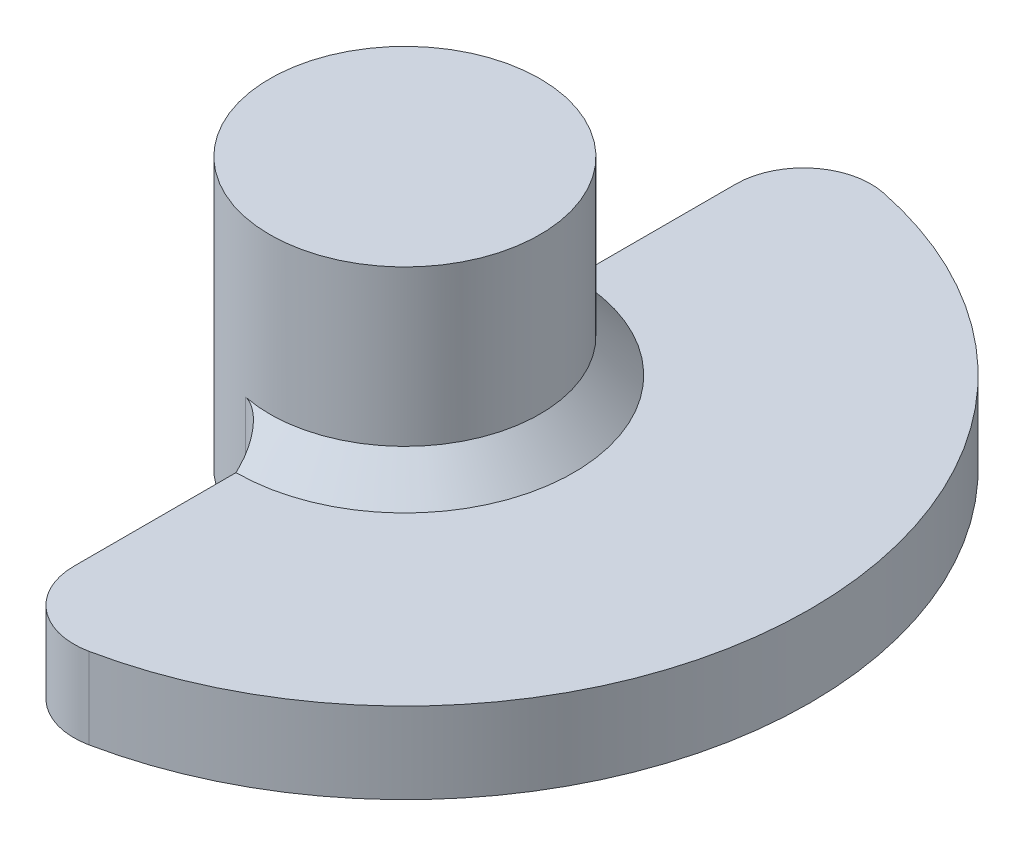
ISO-10303-21;
HEADER;
FILE_DESCRIPTION(('STEP AP214'),'2;1');
FILE_NAME('part.step','',(''),(''),'','','');
FILE_SCHEMA(('AUTOMOTIVE_DESIGN { 1 0 10303 214 1 1 1 1 }'));
ENDSEC;
DATA;
#1=APPLICATION_CONTEXT('core data for automotive mechanical design processes');
#2=APPLICATION_PROTOCOL_DEFINITION('international standard','automotive_design',2000,#1);
#3=PRODUCT_CONTEXT('',#1,'mechanical');
#4=PRODUCT('Part','Part','',(#3));
#5=PRODUCT_RELATED_PRODUCT_CATEGORY('part','',(#4));
#6=PRODUCT_DEFINITION_FORMATION('','',#4);
#7=PRODUCT_DEFINITION_CONTEXT('part definition',#1,'design');
#8=PRODUCT_DEFINITION('design','',#6,#7);
#9=PRODUCT_DEFINITION_SHAPE('','',#8);
#10=(LENGTH_UNIT() NAMED_UNIT(*) SI_UNIT(.MILLI.,.METRE.));
#11=(NAMED_UNIT(*) PLANE_ANGLE_UNIT() SI_UNIT($,.RADIAN.));
#12=(NAMED_UNIT(*) SI_UNIT($,.STERADIAN.) SOLID_ANGLE_UNIT());
#13=UNCERTAINTY_MEASURE_WITH_UNIT(LENGTH_MEASURE(1.E-05),#10,'distance_accuracy_value','');
#14=(GEOMETRIC_REPRESENTATION_CONTEXT(3) GLOBAL_UNCERTAINTY_ASSIGNED_CONTEXT((#13)) GLOBAL_UNIT_ASSIGNED_CONTEXT((#10,
#11,#12)) REPRESENTATION_CONTEXT('',''));
#15=CARTESIAN_POINT('',(0.,0.,0.));
#16=DIRECTION('',(0.,0.,1.));
#17=DIRECTION('',(1.,0.,0.));
#18=AXIS2_PLACEMENT_3D('',#15,#16,#17);
#19=CARTESIAN_POINT('',(-0.5,4.,2.44948974278318));
#20=DIRECTION('',(0.,-1.,0.));
#21=DIRECTION('',(0.,0.,-1.));
#22=AXIS2_PLACEMENT_3D('',#19,#20,#21);
#23=CYLINDRICAL_SURFACE('',#22,0.5);
#24=DIRECTION('',(0.,-1.,0.));
#25=VECTOR('',#24,1.);
#26=CARTESIAN_POINT('',(0.,1.2,2.44948974278318));
#27=LINE('',#26,#25);
#28=CARTESIAN_POINT('',(0.,1.25051025721682,2.44948974278318));
#29=VERTEX_POINT('',#28);
#30=CARTESIAN_POINT('',(0.,0.,2.44948974278318));
#31=VERTEX_POINT('',#30);
#32=EDGE_CURVE('E51',#29,#31,#27,.T.);
#33=ORIENTED_EDGE('',*,*,#32,.F.);
#34=CARTESIAN_POINT('',(0.,1.25051025721682,2.44948974278318));
#35=CARTESIAN_POINT('',(-6.14353030553513E-06,1.26956257086828,2.43043382778847));
#36=CARTESIAN_POINT('',(-0.00108976660980262,1.28862113392152,2.4113786514471));
#37=CARTESIAN_POINT('',(-0.0054575250668246,1.32663904979421,2.37335668815837));
#38=CARTESIAN_POINT('',(-0.00874547038043525,1.34559817346632,2.35439011159714));
#39=CARTESIAN_POINT('',(-0.017617687655025,1.38345173358429,2.31648558111551));
#40=CARTESIAN_POINT('',(-0.0232275589496173,1.40234300246703,2.29755038703823));
#41=CARTESIAN_POINT('',(-0.0368349737107609,1.43962844725048,2.26008241518658));
#42=CARTESIAN_POINT('',(-0.044830481099377,1.45802303251684,2.24154930865243));
#43=CARTESIAN_POINT('',(-0.0656003312018147,1.49845357338365,2.20060237619085));
#44=CARTESIAN_POINT('',(-0.079063062191604,1.52029255766322,2.17833568128627));
#45=CARTESIAN_POINT('',(-0.110262809506088,1.56207266628393,2.13514617991797));
#46=CARTESIAN_POINT('',(-0.127985074994668,1.58202001598268,2.11421904453338));
#47=CARTESIAN_POINT('',(-0.162725343306525,1.61390092672703,2.07980094449228));
#48=CARTESIAN_POINT('',(-0.178621816048546,1.62653784153648,2.06583646584275));
#49=CARTESIAN_POINT('',(-0.213103445669041,1.64956227048323,2.03941646287279));
#50=CARTESIAN_POINT('',(-0.231685289653268,1.65995251743298,2.02695911352506));
#51=CARTESIAN_POINT('',(-0.267017199048256,1.67564938140794,2.00673030050884));
#52=CARTESIAN_POINT('',(-0.283247582352175,1.68157323296841,1.99853393412025));
#53=CARTESIAN_POINT('',(-0.317067551287046,1.69110687175935,1.98379293529205));
#54=CARTESIAN_POINT('',(-0.334653749319388,1.69472222954244,1.97724434998293));
#55=CARTESIAN_POINT('',(-0.360435041680198,1.69800911478319,1.96929415283693));
#56=CARTESIAN_POINT('',(-0.368261577308348,1.69875386512798,1.96708808499204));
#57=CARTESIAN_POINT('',(-0.384043934063315,1.69974964258556,1.96305320959382));
#58=CARTESIAN_POINT('',(-0.391999782212551,1.70000056513028,1.96122448201569));
#59=CARTESIAN_POINT('',(-0.399999999999997,1.70000000000001,1.95959179422654));
#60=B_SPLINE_CURVE_WITH_KNOTS('',3,(#34,#35,#36,#37,#38,#39,#40,#41,#42,#43,#44,#45,#46,#47,#48,
#49,#50,#51,#52,#53,#54,#55,#56,#57,#58,#59),.UNSPECIFIED.,.F.,.F.,(4,2,2,2,2,2,2,2,2,2,2,2,4),
(0.,0.0808242017588837,0.161788460921241,0.243670191726578,0.325482237550086,0.427107132735828,
0.528385045325041,0.602093554281004,0.67571189457858,0.73286653676225,0.789882734431391,
0.81435838198225,0.838839211695834),.UNSPECIFIED.);
#61=CARTESIAN_POINT('',(-0.4,1.7,1.95959179422654));
#62=VERTEX_POINT('',#61);
#63=EDGE_CURVE('E11',#29,#62,#60,.T.);
#64=ORIENTED_EDGE('',*,*,#63,.T.);
#65=DIRECTION('',(0.,-1.,0.));
#66=VECTOR('',#65,1.);
#67=CARTESIAN_POINT('',(-0.4,4.,1.95959179422654));
#68=LINE('',#67,#66);
#69=CARTESIAN_POINT('',(-0.400000000000039,0.,1.95959179422653));
#70=VERTEX_POINT('',#69);
#71=EDGE_CURVE('E161',#70,#62,#68,.F.);
#72=ORIENTED_EDGE('',*,*,#71,.F.);
#73=CARTESIAN_POINT('',(-0.5,0.,2.44948974278318));
#74=DIRECTION('',(0.,1.,0.));
#75=DIRECTION('',(0.,0.,1.));
#76=AXIS2_PLACEMENT_3D('',#73,#74,#75);
#77=CIRCLE('',#76,0.5);
#78=EDGE_CURVE('E163',#70,#31,#77,.F.);
#79=ORIENTED_EDGE('',*,*,#78,.T.);
#80=EDGE_LOOP('',(#33,#64,#72,#79));
#81=FACE_BOUND('',#80,.T.);
#82=ADVANCED_FACE('F33',(#81),#23,.F.);
#83=CARTESIAN_POINT('',(-0.5,4.,-2.44948974278318));
#84=DIRECTION('',(0.,-1.,0.));
#85=DIRECTION('',(0.,0.,-1.));
#86=AXIS2_PLACEMENT_3D('',#83,#84,#85);
#87=CYLINDRICAL_SURFACE('',#86,0.5);
#88=DIRECTION('',(0.,-1.,0.));
#89=VECTOR('',#88,1.);
#90=CARTESIAN_POINT('',(0.,1.2,-2.44948974278318));
#91=LINE('',#90,#89);
#92=CARTESIAN_POINT('',(0.,0.,-2.44948974278318));
#93=VERTEX_POINT('',#92);
#94=CARTESIAN_POINT('',(0.,1.25051025721682,-2.44948974278318));
#95=VERTEX_POINT('',#94);
#96=EDGE_CURVE('E59',#93,#95,#91,.F.);
#97=ORIENTED_EDGE('',*,*,#96,.F.);
#98=CARTESIAN_POINT('',(-0.5,0.,-2.44948974278318));
#99=DIRECTION('',(0.,1.,0.));
#100=DIRECTION('',(0.,0.,1.));
#101=AXIS2_PLACEMENT_3D('',#98,#99,#100);
#102=CIRCLE('',#101,0.5);
#103=CARTESIAN_POINT('',(-0.399999999999998,0.,-1.95959179422654));
#104=VERTEX_POINT('',#103);
#105=EDGE_CURVE('E157',#93,#104,#102,.F.);
#106=ORIENTED_EDGE('',*,*,#105,.T.);
#107=DIRECTION('',(0.,-1.,0.));
#108=VECTOR('',#107,1.);
#109=CARTESIAN_POINT('',(-0.4,4.,-1.95959179422654));
#110=LINE('',#109,#108);
#111=CARTESIAN_POINT('',(-0.4,1.7,-1.95959179422654));
#112=VERTEX_POINT('',#111);
#113=EDGE_CURVE('E154',#112,#104,#110,.T.);
#114=ORIENTED_EDGE('',*,*,#113,.F.);
#115=CARTESIAN_POINT('',(-0.4,1.7,-1.95959179422654));
#116=CARTESIAN_POINT('',(-0.379112475704098,1.70005550004777,-1.96381546746847));
#117=CARTESIAN_POINT('',(-0.358599108827319,1.69830015822592,-1.96943026907582));
#118=CARTESIAN_POINT('',(-0.319120064554992,1.69168034787381,-1.98290493309382));
#119=CARTESIAN_POINT('',(-0.300138686099373,1.68685368899093,-1.99073685941338));
#120=CARTESIAN_POINT('',(-0.264077378204594,1.67461111587338,-2.00819133397604));
#121=CARTESIAN_POINT('',(-0.246988872510726,1.66720756762132,-2.01780522969833));
#122=CARTESIAN_POINT('',(-0.214705596475135,1.65037141475029,-2.03842449570781));
#123=CARTESIAN_POINT('',(-0.199517251514886,1.64093220477786,-2.04943434652086));
#124=CARTESIAN_POINT('',(-0.163158616447119,1.61486093427034,-2.07888146201479));
#125=CARTESIAN_POINT('',(-0.143356051297849,1.59714717068562,-2.09804552403351));
#126=CARTESIAN_POINT('',(-0.108010511982881,1.55940592513827,-2.1379498098953));
#127=CARTESIAN_POINT('',(-0.0924782559662855,1.53937279746655,-2.15869383582123));
#128=CARTESIAN_POINT('',(-0.058883488984244,1.48813960731076,-2.21117887675347));
#129=CARTESIAN_POINT('',(-0.0430416274811878,1.45610296955582,-2.2435210288803));
#130=CARTESIAN_POINT('',(-0.0187513558672276,1.39057278085453,-2.30938390648192));
#131=CARTESIAN_POINT('',(-0.010302226712747,1.35707937193166,-2.34290451700568));
#132=CARTESIAN_POINT('',(-0.00355110558688615,1.31123701984097,-2.3887606276481));
#133=CARTESIAN_POINT('',(-0.00221618584860751,1.29908990973535,-2.40090916961415));
#134=CARTESIAN_POINT('',(-0.000442357297160522,1.27479976300035,-2.42520042574536));
#135=CARTESIAN_POINT('',(-6.90695684497347E-07,1.2626568299146,-2.43734304177776));
#136=CARTESIAN_POINT('',(8.38742400977176E-12,1.25051025721744,-2.44948974278256));
#137=B_SPLINE_CURVE_WITH_KNOTS('',3,(#115,#116,#117,#118,#119,#120,#121,#122,#123,#124,#125,
#126,#127,#128,#129,#130,#131,#132,#133,#134,#135,#136),.UNSPECIFIED.,.F.,.F.,(4,2,2,2,2,2,2,2,
2,2,4),(0.,0.0636729614146139,0.126576849503714,0.189182943933347,0.251995325230502,
0.34972230301138,0.447692374072173,0.591535862634287,0.735365358908738,0.787042203906871,
0.838559259153567),.UNSPECIFIED.);
#138=EDGE_CURVE('E169',#112,#95,#137,.T.);
#139=ORIENTED_EDGE('',*,*,#138,.T.);
#140=EDGE_LOOP('',(#97,#106,#114,#139));
#141=FACE_BOUND('',#140,.T.);
#142=ADVANCED_FACE('F176',(#141),#87,.F.);
#143=CARTESIAN_POINT('',(1.,1.2,-4.89897948556636));
#144=DIRECTION('',(0.,-1.,0.));
#145=DIRECTION('',(0.,0.,-1.));
#146=AXIS2_PLACEMENT_3D('',#143,#144,#145);
#147=CYLINDRICAL_SURFACE('',#146,1.);
#148=DIRECTION('',(0.,-1.,0.));
#149=VECTOR('',#148,1.);
#150=CARTESIAN_POINT('',(0.,1.2,-4.89897948556636));
#151=LINE('',#150,#149);
#152=CARTESIAN_POINT('',(0.,1.2,-4.89897948556636));
#153=VERTEX_POINT('',#152);
#154=CARTESIAN_POINT('',(0.,0.,-4.89897948556636));
#155=VERTEX_POINT('',#154);
#156=EDGE_CURVE('E130',#153,#155,#151,.T.);
#157=ORIENTED_EDGE('',*,*,#156,.F.);
#158=CARTESIAN_POINT('',(1.,1.2,-4.89897948556636));
#159=DIRECTION('',(0.,1.,0.));
#160=DIRECTION('',(0.,0.,1.));
#161=AXIS2_PLACEMENT_3D('',#158,#159,#160);
#162=CIRCLE('',#161,1.);
#163=CARTESIAN_POINT('',(1.2,1.2,-5.87877538267963));
#164=VERTEX_POINT('',#163);
#165=EDGE_CURVE('E149',#164,#153,#162,.T.);
#166=ORIENTED_EDGE('',*,*,#165,.F.);
#167=DIRECTION('',(0.,-1.,0.));
#168=VECTOR('',#167,1.);
#169=CARTESIAN_POINT('',(1.2,1.2,-5.87877538267963));
#170=LINE('',#169,#168);
#171=CARTESIAN_POINT('',(1.2,0.,-5.87877538267963));
#172=VERTEX_POINT('',#171);
#173=EDGE_CURVE('E146',#172,#164,#170,.F.);
#174=ORIENTED_EDGE('',*,*,#173,.F.);
#175=CARTESIAN_POINT('',(1.,0.,-4.89897948556636));
#176=DIRECTION('',(0.,1.,0.));
#177=DIRECTION('',(0.,0.,1.));
#178=AXIS2_PLACEMENT_3D('',#175,#176,#177);
#179=CIRCLE('',#178,1.);
#180=EDGE_CURVE('E151',#155,#172,#179,.F.);
#181=ORIENTED_EDGE('',*,*,#180,.F.);
#182=EDGE_LOOP('',(#157,#166,#174,#181));
#183=FACE_BOUND('',#182,.T.);
#184=ADVANCED_FACE('F180',(#183),#147,.T.);
#185=CARTESIAN_POINT('',(1.,1.2,4.89897948556636));
#186=DIRECTION('',(0.,-1.,0.));
#187=DIRECTION('',(0.,0.,-1.));
#188=AXIS2_PLACEMENT_3D('',#185,#186,#187);
#189=CYLINDRICAL_SURFACE('',#188,1.);
#190=DIRECTION('',(0.,-1.,0.));
#191=VECTOR('',#190,1.);
#192=CARTESIAN_POINT('',(0.,1.2,4.89897948556636));
#193=LINE('',#192,#191);
#194=CARTESIAN_POINT('',(0.,0.,4.89897948556635));
#195=VERTEX_POINT('',#194);
#196=CARTESIAN_POINT('',(0.,1.2,4.89897948556635));
#197=VERTEX_POINT('',#196);
#198=EDGE_CURVE('E126',#195,#197,#193,.F.);
#199=ORIENTED_EDGE('',*,*,#198,.F.);
#200=CARTESIAN_POINT('',(1.,0.,4.89897948556636));
#201=DIRECTION('',(0.,1.,0.));
#202=DIRECTION('',(0.,0.,1.));
#203=AXIS2_PLACEMENT_3D('',#200,#201,#202);
#204=CIRCLE('',#203,1.);
#205=CARTESIAN_POINT('',(1.2000000000071,0.,5.87877538267818));
#206=VERTEX_POINT('',#205);
#207=EDGE_CURVE('E131',#206,#195,#204,.F.);
#208=ORIENTED_EDGE('',*,*,#207,.F.);
#209=DIRECTION('',(0.,-1.,0.));
#210=VECTOR('',#209,1.);
#211=CARTESIAN_POINT('',(1.2,1.2,5.87877538267963));
#212=LINE('',#211,#210);
#213=CARTESIAN_POINT('',(1.2000000000071,1.2,5.87877538267818));
#214=VERTEX_POINT('',#213);
#215=EDGE_CURVE('E128',#214,#206,#212,.T.);
#216=ORIENTED_EDGE('',*,*,#215,.F.);
#217=CARTESIAN_POINT('',(1.,1.2,4.89897948556636));
#218=DIRECTION('',(0.,1.,0.));
#219=DIRECTION('',(0.,0.,1.));
#220=AXIS2_PLACEMENT_3D('',#217,#218,#219);
#221=CIRCLE('',#220,1.);
#222=EDGE_CURVE('E113',#197,#214,#221,.T.);
#223=ORIENTED_EDGE('',*,*,#222,.F.);
#224=EDGE_LOOP('',(#199,#208,#216,#223));
#225=FACE_BOUND('',#224,.T.);
#226=ADVANCED_FACE('F125',(#225),#189,.T.);
#227=CARTESIAN_POINT('',(0.,1.2,-6.));
#228=DIRECTION('',(1.,0.,0.));
#229=DIRECTION('',(0.,0.,-1.));
#230=AXIS2_PLACEMENT_3D('',#227,#228,#229);
#231=PLANE('',#230);
#232=DIRECTION('',(0.,0.,1.));
#233=VECTOR('',#232,1.);
#234=CARTESIAN_POINT('',(0.,1.2,-6.));
#235=LINE('',#234,#233);
#236=CARTESIAN_POINT('',(0.,1.2,2.49999999999999));
#237=VERTEX_POINT('',#236);
#238=EDGE_CURVE('E108',#237,#197,#235,.T.);
#239=ORIENTED_EDGE('',*,*,#238,.F.);
#240=DIRECTION('',(0.,-0.70710678118655,0.707106781186545));
#241=VECTOR('',#240,1.);
#242=CARTESIAN_POINT('',(0.,3.70000000000002,0.));
#243=LINE('',#242,#241);
#244=EDGE_CURVE('E45',#237,#29,#243,.F.);
#245=ORIENTED_EDGE('',*,*,#244,.T.);
#246=ORIENTED_EDGE('',*,*,#32,.T.);
#247=DIRECTION('',(0.,0.,1.));
#248=VECTOR('',#247,1.);
#249=CARTESIAN_POINT('',(0.,0.,-6.));
#250=LINE('',#249,#248);
#251=EDGE_CURVE('E135',#31,#195,#250,.T.);
#252=ORIENTED_EDGE('',*,*,#251,.T.);
#253=ORIENTED_EDGE('',*,*,#198,.T.);
#254=EDGE_LOOP('',(#239,#245,#246,#252,#253));
#255=FACE_BOUND('',#254,.T.);
#256=ADVANCED_FACE('F133',(#255),#231,.F.);
#257=CARTESIAN_POINT('',(0.,1.2,0.));
#258=DIRECTION('',(0.,-1.,0.));
#259=DIRECTION('',(0.,0.,-1.));
#260=AXIS2_PLACEMENT_3D('',#257,#258,#259);
#261=CYLINDRICAL_SURFACE('',#260,6.);
#262=CARTESIAN_POINT('',(0.,0.,0.));
#263=DIRECTION('',(0.,1.,0.));
#264=DIRECTION('',(0.,0.,1.));
#265=AXIS2_PLACEMENT_3D('',#262,#263,#264);
#266=CIRCLE('',#265,6.);
#267=EDGE_CURVE('E297',#206,#172,#266,.T.);
#268=ORIENTED_EDGE('',*,*,#267,.T.);
#269=ORIENTED_EDGE('',*,*,#173,.T.);
#270=CARTESIAN_POINT('',(0.,1.2,0.));
#271=DIRECTION('',(0.,1.,0.));
#272=DIRECTION('',(0.,0.,1.));
#273=AXIS2_PLACEMENT_3D('',#270,#271,#272);
#274=CIRCLE('',#273,6.);
#275=EDGE_CURVE('E121',#214,#164,#274,.T.);
#276=ORIENTED_EDGE('',*,*,#275,.F.);
#277=ORIENTED_EDGE('',*,*,#215,.T.);
#278=EDGE_LOOP('',(#268,#269,#276,#277));
#279=FACE_BOUND('',#278,.T.);
#280=ADVANCED_FACE('F211',(#279),#261,.T.);
#281=EDGE_CURVE('E140',#155,#93,#250,.T.);
#282=ORIENTED_EDGE('',*,*,#281,.T.);
#283=ORIENTED_EDGE('',*,*,#96,.T.);
#284=DIRECTION('',(0.,0.70710678118655,0.707106781186545));
#285=VECTOR('',#284,1.);
#286=CARTESIAN_POINT('',(0.,3.70000000000002,0.));
#287=LINE('',#286,#285);
#288=CARTESIAN_POINT('',(0.,1.2,-2.5));
#289=VERTEX_POINT('',#288);
#290=EDGE_CURVE('E175',#95,#289,#287,.F.);
#291=ORIENTED_EDGE('',*,*,#290,.T.);
#292=EDGE_CURVE('E120',#153,#289,#235,.T.);
#293=ORIENTED_EDGE('',*,*,#292,.F.);
#294=ORIENTED_EDGE('',*,*,#156,.T.);
#295=EDGE_LOOP('',(#282,#283,#291,#293,#294));
#296=FACE_BOUND('',#295,.T.);
#297=ADVANCED_FACE('F213',(#296),#231,.F.);
#298=CARTESIAN_POINT('',(0.,1.2,0.));
#299=DIRECTION('',(0.,1.,0.));
#300=DIRECTION('',(0.,0.,1.));
#301=AXIS2_PLACEMENT_3D('',#298,#299,#300);
#302=PLANE('',#301);
#303=ORIENTED_EDGE('',*,*,#292,.T.);
#304=CARTESIAN_POINT('',(0.,1.2,0.));
#305=DIRECTION('',(0.,1.,0.));
#306=DIRECTION('',(0.,0.,1.));
#307=AXIS2_PLACEMENT_3D('',#304,#305,#306);
#308=CIRCLE('',#307,2.5);
#309=EDGE_CURVE('E116',#289,#237,#308,.F.);
#310=ORIENTED_EDGE('',*,*,#309,.T.);
#311=ORIENTED_EDGE('',*,*,#238,.T.);
#312=ORIENTED_EDGE('',*,*,#222,.T.);
#313=ORIENTED_EDGE('',*,*,#275,.T.);
#314=ORIENTED_EDGE('',*,*,#165,.T.);
#315=EDGE_LOOP('',(#303,#310,#311,#312,#313,#314));
#316=FACE_BOUND('',#315,.T.);
#317=ADVANCED_FACE('F111',(#316),#302,.T.);
#318=CARTESIAN_POINT('',(0.,0.,0.));
#319=DIRECTION('',(0.,1.,0.));
#320=DIRECTION('',(0.,0.,1.));
#321=AXIS2_PLACEMENT_3D('',#318,#319,#320);
#322=PLANE('',#321);
#323=ORIENTED_EDGE('',*,*,#78,.F.);
#324=CARTESIAN_POINT('',(0.,0.,0.));
#325=DIRECTION('',(0.,-1.,0.));
#326=DIRECTION('',(0.,0.,-1.));
#327=AXIS2_PLACEMENT_3D('',#324,#325,#326);
#328=CIRCLE('',#327,2.);
#329=EDGE_CURVE('E301',#70,#104,#328,.T.);
#330=ORIENTED_EDGE('',*,*,#329,.T.);
#331=ORIENTED_EDGE('',*,*,#105,.F.);
#332=ORIENTED_EDGE('',*,*,#281,.F.);
#333=ORIENTED_EDGE('',*,*,#180,.T.);
#334=ORIENTED_EDGE('',*,*,#267,.F.);
#335=ORIENTED_EDGE('',*,*,#207,.T.);
#336=ORIENTED_EDGE('',*,*,#251,.F.);
#337=EDGE_LOOP('',(#323,#330,#331,#332,#333,#334,#335,#336));
#338=FACE_BOUND('',#337,.T.);
#339=ADVANCED_FACE('F230',(#338),#322,.F.);
#340=CARTESIAN_POINT('',(0.,4.,0.));
#341=DIRECTION('',(0.,-1.,0.));
#342=DIRECTION('',(0.,0.,-1.));
#343=AXIS2_PLACEMENT_3D('',#340,#341,#342);
#344=CYLINDRICAL_SURFACE('',#343,2.);
#345=CARTESIAN_POINT('',(0.,4.,0.));
#346=DIRECTION('',(0.,-1.,0.));
#347=DIRECTION('',(0.,0.,-1.));
#348=AXIS2_PLACEMENT_3D('',#345,#346,#347);
#349=CIRCLE('',#348,2.);
#350=CARTESIAN_POINT('',(0.,4.,-2.));
#351=VERTEX_POINT('',#350);
#352=EDGE_CURVE('E299',#351,#351,#349,.T.);
#353=ORIENTED_EDGE('',*,*,#352,.T.);
#354=EDGE_LOOP('',(#353));
#355=FACE_BOUND('',#354,.T.);
#356=CARTESIAN_POINT('',(0.,1.7,0.));
#357=DIRECTION('',(0.,1.,0.));
#358=DIRECTION('',(0.,0.,1.));
#359=AXIS2_PLACEMENT_3D('',#356,#357,#358);
#360=CIRCLE('',#359,2.);
#361=EDGE_CURVE('E165',#62,#112,#360,.T.);
#362=ORIENTED_EDGE('',*,*,#361,.T.);
#363=ORIENTED_EDGE('',*,*,#113,.T.);
#364=ORIENTED_EDGE('',*,*,#329,.F.);
#365=ORIENTED_EDGE('',*,*,#71,.T.);
#366=EDGE_LOOP('',(#362,#363,#364,#365));
#367=FACE_BOUND('',#366,.T.);
#368=ADVANCED_FACE('F237',(#355,#367),#344,.T.);
#369=CARTESIAN_POINT('',(0.,4.,0.));
#370=DIRECTION('',(0.,-1.,0.));
#371=DIRECTION('',(0.,0.,-1.));
#372=AXIS2_PLACEMENT_3D('',#369,#370,#371);
#373=PLANE('',#372);
#374=ORIENTED_EDGE('',*,*,#352,.F.);
#375=EDGE_LOOP('',(#374));
#376=FACE_BOUND('',#375,.T.);
#377=ADVANCED_FACE('F244',(#376),#373,.F.);
#378=CARTESIAN_POINT('',(0.,1.7,0.));
#379=DIRECTION('',(0.,-1.,0.));
#380=DIRECTION('',(0.,0.,-1.));
#381=AXIS2_PLACEMENT_3D('',#378,#379,#380);
#382=CONICAL_SURFACE('',#381,2.,0.785398163397445);
#383=ORIENTED_EDGE('',*,*,#244,.F.);
#384=ORIENTED_EDGE('',*,*,#309,.F.);
#385=ORIENTED_EDGE('',*,*,#290,.F.);
#386=ORIENTED_EDGE('',*,*,#138,.F.);
#387=ORIENTED_EDGE('',*,*,#361,.F.);
#388=ORIENTED_EDGE('',*,*,#63,.F.);
#389=EDGE_LOOP('',(#383,#384,#385,#386,#387,#388));
#390=FACE_BOUND('',#389,.T.);
#391=ADVANCED_FACE('F35',(#390),#382,.T.);
#392=CLOSED_SHELL('',(#82,#142,#184,#226,#256,#280,#297,#317,#339,#368,#377,#391));
#393=MANIFOLD_SOLID_BREP('B2',#392);
#394=ADVANCED_BREP_SHAPE_REPRESENTATION('',(#18,#393),#14);
#395=SHAPE_DEFINITION_REPRESENTATION(#9,#394);
ENDSEC;
END-ISO-10303-21;
